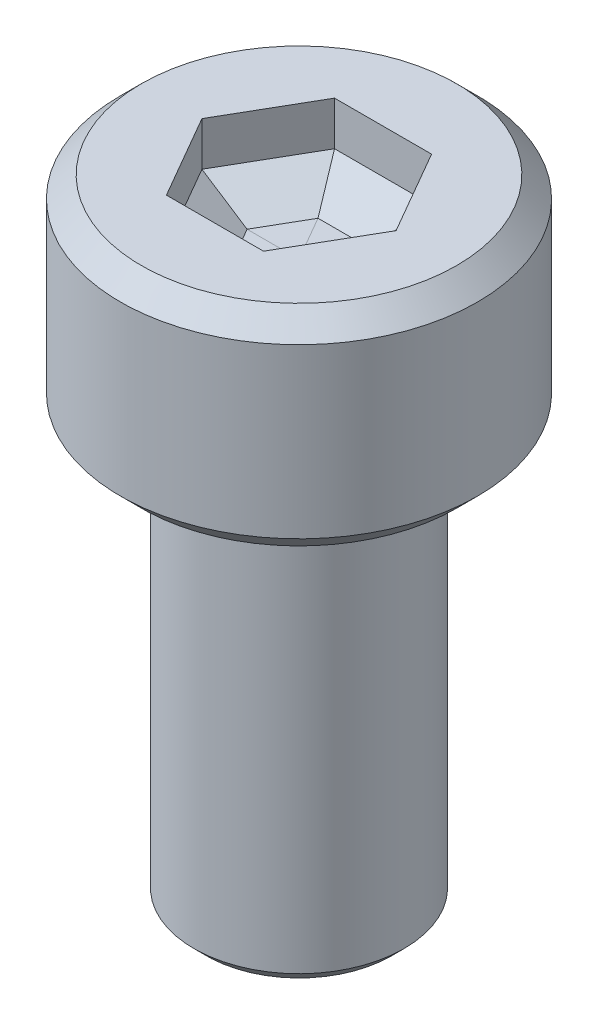
ISO-10303-21;
HEADER;
FILE_DESCRIPTION(('STEP AP214'),'2;1');
FILE_NAME('part.step','',(''),(''),'','','');
FILE_SCHEMA(('AUTOMOTIVE_DESIGN { 1 0 10303 214 1 1 1 1 }'));
ENDSEC;
DATA;
#1=APPLICATION_CONTEXT('core data for automotive mechanical design processes');
#2=APPLICATION_PROTOCOL_DEFINITION('international standard','automotive_design',2000,#1);
#3=PRODUCT_CONTEXT('',#1,'mechanical');
#4=PRODUCT('Part','Part','',(#3));
#5=PRODUCT_RELATED_PRODUCT_CATEGORY('part','',(#4));
#6=PRODUCT_DEFINITION_FORMATION('','',#4);
#7=PRODUCT_DEFINITION_CONTEXT('part definition',#1,'design');
#8=PRODUCT_DEFINITION('design','',#6,#7);
#9=PRODUCT_DEFINITION_SHAPE('','',#8);
#10=(LENGTH_UNIT() NAMED_UNIT(*) SI_UNIT(.MILLI.,.METRE.));
#11=(NAMED_UNIT(*) PLANE_ANGLE_UNIT() SI_UNIT($,.RADIAN.));
#12=(NAMED_UNIT(*) SI_UNIT($,.STERADIAN.) SOLID_ANGLE_UNIT());
#13=UNCERTAINTY_MEASURE_WITH_UNIT(LENGTH_MEASURE(1.E-05),#10,'distance_accuracy_value','');
#14=(GEOMETRIC_REPRESENTATION_CONTEXT(3) GLOBAL_UNCERTAINTY_ASSIGNED_CONTEXT((#13)) GLOBAL_UNIT_ASSIGNED_CONTEXT((#10,
#11,#12)) REPRESENTATION_CONTEXT('',''));
#15=CARTESIAN_POINT('',(0.,0.,0.));
#16=DIRECTION('',(0.,0.,1.));
#17=DIRECTION('',(1.,0.,0.));
#18=AXIS2_PLACEMENT_3D('',#15,#16,#17);
#19=CARTESIAN_POINT('',(4.25,5.00000000000001,0.));
#20=DIRECTION('',(0.,1.,0.));
#21=DIRECTION('',(-1.,0.,0.));
#22=AXIS2_PLACEMENT_3D('',#19,#20,#21);
#23=PLANE('',#22);
#24=DIRECTION('',(0.5,0.,-0.866025403784439));
#25=VECTOR('',#24,1.);
#26=CARTESIAN_POINT('',(-2.30940107675852,4.99999999999998,0.));
#27=LINE('',#26,#25);
#28=CARTESIAN_POINT('',(-2.30940107675852,4.99999999999998,0.));
#29=VERTEX_POINT('',#28);
#30=CARTESIAN_POINT('',(-1.15470053837928,4.99999999999999,-2.));
#31=VERTEX_POINT('',#30);
#32=EDGE_CURVE('E113',#29,#31,#27,.T.);
#33=ORIENTED_EDGE('',*,*,#32,.T.);
#34=DIRECTION('',(1.,0.,0.));
#35=VECTOR('',#34,1.);
#36=CARTESIAN_POINT('',(-1.15470053837929,4.99999999999998,-2.));
#37=LINE('',#36,#35);
#38=CARTESIAN_POINT('',(1.15470053837922,4.99999999999999,-2.00000000000001));
#39=VERTEX_POINT('',#38);
#40=EDGE_CURVE('E137',#31,#39,#37,.T.);
#41=ORIENTED_EDGE('',*,*,#40,.T.);
#42=DIRECTION('',(0.5,0.,0.866025403784439));
#43=VECTOR('',#42,1.);
#44=CARTESIAN_POINT('',(1.15470053837923,4.99999999999999,-2.00000000000001));
#45=LINE('',#44,#43);
#46=CARTESIAN_POINT('',(2.30940107675848,5.,0.));
#47=VERTEX_POINT('',#46);
#48=EDGE_CURVE('E462',#39,#47,#45,.T.);
#49=ORIENTED_EDGE('',*,*,#48,.T.);
#50=DIRECTION('',(-0.5,0.,0.866025403784439));
#51=VECTOR('',#50,1.);
#52=CARTESIAN_POINT('',(2.30940107675848,5.,0.));
#53=LINE('',#52,#51);
#54=CARTESIAN_POINT('',(1.15470053837923,5.,2.));
#55=VERTEX_POINT('',#54);
#56=EDGE_CURVE('E450',#47,#55,#53,.T.);
#57=ORIENTED_EDGE('',*,*,#56,.T.);
#58=DIRECTION('',(-1.,0.,0.));
#59=VECTOR('',#58,1.);
#60=CARTESIAN_POINT('',(1.15470053837923,5.,2.));
#61=LINE('',#60,#59);
#62=CARTESIAN_POINT('',(-1.15470053837927,4.99999999999999,2.));
#63=VERTEX_POINT('',#62);
#64=EDGE_CURVE('E47',#55,#63,#61,.T.);
#65=ORIENTED_EDGE('',*,*,#64,.T.);
#66=DIRECTION('',(-0.5,0.,-0.866025403784439));
#67=VECTOR('',#66,1.);
#68=CARTESIAN_POINT('',(-1.15470053837927,4.99999999999999,2.));
#69=LINE('',#68,#67);
#70=EDGE_CURVE('E106',#63,#29,#69,.T.);
#71=ORIENTED_EDGE('',*,*,#70,.T.);
#72=EDGE_LOOP('',(#33,#41,#49,#57,#65,#71));
#73=FACE_BOUND('',#72,.T.);
#74=CARTESIAN_POINT('',(0.,4.99999999999999,0.));
#75=DIRECTION('',(0.,1.,0.));
#76=DIRECTION('',(-1.,0.,0.));
#77=AXIS2_PLACEMENT_3D('',#74,#75,#76);
#78=CIRCLE('',#77,3.74999999999997);
#79=CARTESIAN_POINT('',(-3.74999999999999,4.99999999999998,0.));
#80=VERTEX_POINT('',#79);
#81=EDGE_CURVE('E11',#80,#80,#78,.T.);
#82=ORIENTED_EDGE('',*,*,#81,.T.);
#83=EDGE_LOOP('',(#82));
#84=FACE_BOUND('',#83,.T.);
#85=ADVANCED_FACE('F32',(#73,#84),#23,.T.);
#86=CARTESIAN_POINT('',(0.,-10.,0.));
#87=DIRECTION('',(0.,-1.,0.));
#88=DIRECTION('',(1.,0.,0.));
#89=AXIS2_PLACEMENT_3D('',#86,#87,#88);
#90=PLANE('',#89);
#91=CARTESIAN_POINT('',(0.,-10.,0.));
#92=DIRECTION('',(0.,-1.,0.));
#93=DIRECTION('',(1.,0.,0.));
#94=AXIS2_PLACEMENT_3D('',#91,#92,#93);
#95=CIRCLE('',#94,2.20000000000008);
#96=CARTESIAN_POINT('',(2.20000000000011,-9.99999999999999,0.));
#97=VERTEX_POINT('',#96);
#98=EDGE_CURVE('E149',#97,#97,#95,.T.);
#99=ORIENTED_EDGE('',*,*,#98,.T.);
#100=EDGE_LOOP('',(#99));
#101=FACE_BOUND('',#100,.T.);
#102=ADVANCED_FACE('F186',(#101),#90,.T.);
#103=CARTESIAN_POINT('',(3.49148133884313E-12,-1001.19875270073,0.));
#104=DIRECTION('',(0.,-1.,0.));
#105=DIRECTION('',(1.,0.,0.));
#106=AXIS2_PLACEMENT_3D('',#103,#104,#105);
#107=CYLINDRICAL_SURFACE('',#106,2.49999999999999);
#108=CARTESIAN_POINT('',(0.,-9.70000000000004,0.));
#109=DIRECTION('',(0.,-1.,0.));
#110=DIRECTION('',(1.,0.,0.));
#111=AXIS2_PLACEMENT_3D('',#108,#109,#110);
#112=CIRCLE('',#111,2.49999999999999);
#113=CARTESIAN_POINT('',(2.50000000000002,-9.70000000000003,0.));
#114=VERTEX_POINT('',#113);
#115=EDGE_CURVE('E152',#114,#114,#112,.F.);
#116=ORIENTED_EDGE('',*,*,#115,.T.);
#117=EDGE_LOOP('',(#116));
#118=FACE_BOUND('',#117,.T.);
#119=CARTESIAN_POINT('',(0.,-0.199999999999978,0.));
#120=DIRECTION('',(0.,-1.,0.));
#121=DIRECTION('',(1.,0.,0.));
#122=AXIS2_PLACEMENT_3D('',#119,#120,#121);
#123=CIRCLE('',#122,2.49999999999999);
#124=CARTESIAN_POINT('',(2.49999999999998,-0.199999999999969,0.));
#125=VERTEX_POINT('',#124);
#126=EDGE_CURVE('E142',#125,#125,#123,.T.);
#127=ORIENTED_EDGE('',*,*,#126,.T.);
#128=EDGE_LOOP('',(#127));
#129=FACE_BOUND('',#128,.T.);
#130=ADVANCED_FACE('F175',(#118,#129),#107,.T.);
#131=CARTESIAN_POINT('',(2.5,0.,0.));
#132=DIRECTION('',(0.,-1.,0.));
#133=DIRECTION('',(1.,0.,0.));
#134=AXIS2_PLACEMENT_3D('',#131,#132,#133);
#135=PLANE('',#134);
#136=CARTESIAN_POINT('',(0.,0.,0.));
#137=DIRECTION('',(0.,-1.,0.));
#138=DIRECTION('',(1.,0.,0.));
#139=AXIS2_PLACEMENT_3D('',#136,#137,#138);
#140=CIRCLE('',#139,3.75000000000006);
#141=CARTESIAN_POINT('',(3.75000000000005,0.,0.));
#142=VERTEX_POINT('',#141);
#143=EDGE_CURVE('E155',#142,#142,#140,.T.);
#144=ORIENTED_EDGE('',*,*,#143,.T.);
#145=EDGE_LOOP('',(#144));
#146=FACE_BOUND('',#145,.T.);
#147=CARTESIAN_POINT('',(0.,0.,0.));
#148=DIRECTION('',(0.,-1.,0.));
#149=DIRECTION('',(1.,0.,0.));
#150=AXIS2_PLACEMENT_3D('',#147,#148,#149);
#151=CIRCLE('',#150,2.69999999999999);
#152=CARTESIAN_POINT('',(2.69999999999998,0.,0.));
#153=VERTEX_POINT('',#152);
#154=EDGE_CURVE('E145',#153,#153,#151,.F.);
#155=ORIENTED_EDGE('',*,*,#154,.T.);
#156=EDGE_LOOP('',(#155));
#157=FACE_BOUND('',#156,.T.);
#158=ADVANCED_FACE('F172',(#146,#157),#135,.T.);
#159=CARTESIAN_POINT('',(3.49148133884313E-12,-1001.19875270073,0.));
#160=DIRECTION('',(0.,-1.,0.));
#161=DIRECTION('',(1.,0.,0.));
#162=AXIS2_PLACEMENT_3D('',#159,#160,#161);
#163=CYLINDRICAL_SURFACE('',#162,4.25000000000001);
#164=CARTESIAN_POINT('',(0.,0.499999999999945,0.));
#165=DIRECTION('',(0.,-1.,0.));
#166=DIRECTION('',(1.,0.,0.));
#167=AXIS2_PLACEMENT_3D('',#164,#165,#166);
#168=CIRCLE('',#167,4.25000000000001);
#169=CARTESIAN_POINT('',(4.25000000000001,0.49999999999996,0.));
#170=VERTEX_POINT('',#169);
#171=EDGE_CURVE('E40',#170,#170,#168,.F.);
#172=ORIENTED_EDGE('',*,*,#171,.T.);
#173=EDGE_LOOP('',(#172));
#174=FACE_BOUND('',#173,.T.);
#175=CARTESIAN_POINT('',(0.,4.49999999999995,0.));
#176=DIRECTION('',(0.,1.,0.));
#177=DIRECTION('',(-1.,0.,0.));
#178=AXIS2_PLACEMENT_3D('',#175,#176,#177);
#179=CIRCLE('',#178,4.25000000000001);
#180=CARTESIAN_POINT('',(-4.25000000000003,4.49999999999993,0.));
#181=VERTEX_POINT('',#180);
#182=EDGE_CURVE('E158',#181,#181,#179,.F.);
#183=ORIENTED_EDGE('',*,*,#182,.T.);
#184=EDGE_LOOP('',(#183));
#185=FACE_BOUND('',#184,.T.);
#186=ADVANCED_FACE('F163',(#174,#185),#163,.T.);
#187=CARTESIAN_POINT('',(0.,-0.199999999999978,0.));
#188=DIRECTION('',(0.,-1.,0.));
#189=DIRECTION('',(1.,0.,0.));
#190=AXIS2_PLACEMENT_3D('',#187,#188,#189);
#191=TOROIDAL_SURFACE('',#190,2.69999999999999,0.2);
#192=ORIENTED_EDGE('',*,*,#154,.F.);
#193=EDGE_LOOP('',(#192));
#194=FACE_BOUND('',#193,.T.);
#195=ORIENTED_EDGE('',*,*,#126,.F.);
#196=EDGE_LOOP('',(#195));
#197=FACE_BOUND('',#196,.T.);
#198=ADVANCED_FACE('F179',(#194,#197),#191,.F.);
#199=CARTESIAN_POINT('',(0.,-10.,0.));
#200=DIRECTION('',(0.,1.,0.));
#201=DIRECTION('',(-1.,0.,0.));
#202=AXIS2_PLACEMENT_3D('',#199,#200,#201);
#203=CONICAL_SURFACE('',#202,2.20000000000007,0.785398163397357);
#204=ORIENTED_EDGE('',*,*,#115,.F.);
#205=EDGE_LOOP('',(#204));
#206=FACE_BOUND('',#205,.T.);
#207=ORIENTED_EDGE('',*,*,#98,.F.);
#208=EDGE_LOOP('',(#207));
#209=FACE_BOUND('',#208,.T.);
#210=ADVANCED_FACE('F169',(#206,#209),#203,.T.);
#211=CARTESIAN_POINT('',(0.,0.,0.));
#212=DIRECTION('',(0.,1.,0.));
#213=DIRECTION('',(-1.,0.,0.));
#214=AXIS2_PLACEMENT_3D('',#211,#212,#213);
#215=CONICAL_SURFACE('',#214,3.75000000000007,0.785398163397449);
#216=ORIENTED_EDGE('',*,*,#171,.F.);
#217=EDGE_LOOP('',(#216));
#218=FACE_BOUND('',#217,.T.);
#219=ORIENTED_EDGE('',*,*,#143,.F.);
#220=EDGE_LOOP('',(#219));
#221=FACE_BOUND('',#220,.T.);
#222=ADVANCED_FACE('F166',(#218,#221),#215,.T.);
#223=CARTESIAN_POINT('',(0.,4.49999999999995,0.));
#224=DIRECTION('',(0.,-1.,0.));
#225=DIRECTION('',(1.,0.,0.));
#226=AXIS2_PLACEMENT_3D('',#223,#224,#225);
#227=CONICAL_SURFACE('',#226,4.25000000000001,0.785398163397449);
#228=ORIENTED_EDGE('',*,*,#81,.F.);
#229=EDGE_LOOP('',(#228));
#230=FACE_BOUND('',#229,.T.);
#231=ORIENTED_EDGE('',*,*,#182,.F.);
#232=EDGE_LOOP('',(#231));
#233=FACE_BOUND('',#232,.T.);
#234=ADVANCED_FACE('F34',(#230,#233),#227,.T.);
#235=CARTESIAN_POINT('',(-2.30940107675852,4.99999999999998,0.));
#236=DIRECTION('',(-0.866025403784439,0.,-0.5));
#237=DIRECTION('',(-0.5,0.,0.866025403784439));
#238=AXIS2_PLACEMENT_3D('',#235,#236,#237);
#239=PLANE('',#238);
#240=ORIENTED_EDGE('',*,*,#32,.F.);
#241=DIRECTION('',(0.,1.,0.));
#242=VECTOR('',#241,1.);
#243=CARTESIAN_POINT('',(-2.30940107675852,4.99999999999998,0.));
#244=LINE('',#243,#242);
#245=CARTESIAN_POINT('',(-2.30940107675851,3.9563163170868,0.));
#246=VERTEX_POINT('',#245);
#247=EDGE_CURVE('E101',#246,#29,#244,.T.);
#248=ORIENTED_EDGE('',*,*,#247,.F.);
#249=DIRECTION('',(0.5,0.,-0.866025403784439));
#250=VECTOR('',#249,1.);
#251=CARTESIAN_POINT('',(-2.30940107675851,3.9563163170868,0.));
#252=LINE('',#251,#250);
#253=CARTESIAN_POINT('',(-1.15470053837927,3.9563163170868,-2.));
#254=VERTEX_POINT('',#253);
#255=EDGE_CURVE('E119',#246,#254,#252,.T.);
#256=ORIENTED_EDGE('',*,*,#255,.T.);
#257=DIRECTION('',(0.,1.,0.));
#258=VECTOR('',#257,1.);
#259=CARTESIAN_POINT('',(-1.15470053837929,4.99999999999998,-2.));
#260=LINE('',#259,#258);
#261=EDGE_CURVE('E115',#254,#31,#260,.T.);
#262=ORIENTED_EDGE('',*,*,#261,.T.);
#263=EDGE_LOOP('',(#240,#248,#256,#262));
#264=FACE_BOUND('',#263,.T.);
#265=ADVANCED_FACE('F114',(#264),#239,.F.);
#266=CARTESIAN_POINT('',(0.,3.25752210362396,0.));
#267=DIRECTION('',(0.,-1.,0.));
#268=DIRECTION('',(1.,0.,0.));
#269=AXIS2_PLACEMENT_3D('',#266,#267,#268);
#270=PLANE('',#269);
#271=DIRECTION('',(0.5,0.,-0.866025403784439));
#272=VECTOR('',#271,1.);
#273=CARTESIAN_POINT('',(-1.23537689685806,3.25752210362395,0.));
#274=LINE('',#273,#272);
#275=CARTESIAN_POINT('',(-1.23537689685807,3.25752210362395,0.));
#276=VERTEX_POINT('',#275);
#277=CARTESIAN_POINT('',(-0.617688448429044,3.25752210362395,-1.06986777592746));
#278=VERTEX_POINT('',#277);
#279=EDGE_CURVE('E134',#276,#278,#274,.T.);
#280=ORIENTED_EDGE('',*,*,#279,.F.);
#281=DIRECTION('',(1.,0.,0.));
#282=VECTOR('',#281,1.);
#283=CARTESIAN_POINT('',(0.,3.25752210362396,0.));
#284=LINE('',#283,#282);
#285=CARTESIAN_POINT('',(0.,3.25752210362396,0.));
#286=VERTEX_POINT('',#285);
#287=EDGE_CURVE('E123',#276,#286,#284,.T.);
#288=ORIENTED_EDGE('',*,*,#287,.T.);
#289=DIRECTION('',(-0.5,0.,-0.866025403784439));
#290=VECTOR('',#289,1.);
#291=CARTESIAN_POINT('',(0.,3.25752210362396,0.));
#292=LINE('',#291,#290);
#293=EDGE_CURVE('E56',#286,#278,#292,.T.);
#294=ORIENTED_EDGE('',*,*,#293,.T.);
#295=EDGE_LOOP('',(#280,#288,#294));
#296=FACE_BOUND('',#295,.T.);
#297=ADVANCED_FACE('F228',(#296),#270,.F.);
#298=CARTESIAN_POINT('',(-2.30940107675851,3.9563163170868,0.));
#299=DIRECTION('',(-0.520184407756901,-0.799506666160745,-0.300328607846694));
#300=DIRECTION('',(0.838201573918949,-0.545360542650269,0.));
#301=AXIS2_PLACEMENT_3D('',#298,#299,#300);
#302=PLANE('',#301);
#303=ORIENTED_EDGE('',*,*,#255,.F.);
#304=DIRECTION('',(0.838201573918949,-0.545360542650269,0.));
#305=VECTOR('',#304,1.);
#306=CARTESIAN_POINT('',(-1.49812940337573,3.42847722229215,0.));
#307=LINE('',#306,#305);
#308=EDGE_CURVE('E125',#246,#276,#307,.T.);
#309=ORIENTED_EDGE('',*,*,#308,.T.);
#310=ORIENTED_EDGE('',*,*,#279,.T.);
#311=DIRECTION('',(-0.419100786959478,0.545360542650269,-0.725903856505909));
#312=VECTOR('',#311,1.);
#313=CARTESIAN_POINT('',(-1.15470053837928,3.9563163170868,-2.));
#314=LINE('',#313,#312);
#315=EDGE_CURVE('E494',#278,#254,#314,.T.);
#316=ORIENTED_EDGE('',*,*,#315,.T.);
#317=EDGE_LOOP('',(#303,#309,#310,#316));
#318=FACE_BOUND('',#317,.T.);
#319=ADVANCED_FACE('F235',(#318),#302,.F.);
#320=CARTESIAN_POINT('',(-1.15470053837927,4.99999999999999,2.));
#321=DIRECTION('',(-0.866025403784439,0.,0.5));
#322=DIRECTION('',(0.5,0.,0.866025403784439));
#323=AXIS2_PLACEMENT_3D('',#320,#321,#322);
#324=PLANE('',#323);
#325=ORIENTED_EDGE('',*,*,#70,.F.);
#326=DIRECTION('',(0.,1.,0.));
#327=VECTOR('',#326,1.);
#328=CARTESIAN_POINT('',(-1.15470053837927,4.99999999999999,2.));
#329=LINE('',#328,#327);
#330=CARTESIAN_POINT('',(-1.15470053837927,3.9563163170868,2.));
#331=VERTEX_POINT('',#330);
#332=EDGE_CURVE('E478',#331,#63,#329,.T.);
#333=ORIENTED_EDGE('',*,*,#332,.F.);
#334=DIRECTION('',(-0.5,0.,-0.866025403784439));
#335=VECTOR('',#334,1.);
#336=CARTESIAN_POINT('',(-1.15470053837926,3.9563163170868,2.));
#337=LINE('',#336,#335);
#338=EDGE_CURVE('E108',#331,#246,#337,.T.);
#339=ORIENTED_EDGE('',*,*,#338,.T.);
#340=ORIENTED_EDGE('',*,*,#247,.T.);
#341=EDGE_LOOP('',(#325,#333,#339,#340));
#342=FACE_BOUND('',#341,.T.);
#343=ADVANCED_FACE('F103',(#342),#324,.F.);
#344=CARTESIAN_POINT('',(0.,3.25752210362396,0.));
#345=DIRECTION('',(0.,-1.,0.));
#346=DIRECTION('',(1.,0.,0.));
#347=AXIS2_PLACEMENT_3D('',#344,#345,#346);
#348=PLANE('',#347);
#349=DIRECTION('',(-0.5,0.,-0.866025403784439));
#350=VECTOR('',#349,1.);
#351=CARTESIAN_POINT('',(-0.617688448429039,3.25752210362395,1.06986777592746));
#352=LINE('',#351,#350);
#353=CARTESIAN_POINT('',(-0.617688448429039,3.25752210362395,1.06986777592746));
#354=VERTEX_POINT('',#353);
#355=EDGE_CURVE('E132',#354,#276,#352,.T.);
#356=ORIENTED_EDGE('',*,*,#355,.F.);
#357=DIRECTION('',(0.5,0.,-0.866025403784439));
#358=VECTOR('',#357,1.);
#359=CARTESIAN_POINT('',(0.,3.25752210362396,0.));
#360=LINE('',#359,#358);
#361=EDGE_CURVE('E479',#354,#286,#360,.T.);
#362=ORIENTED_EDGE('',*,*,#361,.T.);
#363=ORIENTED_EDGE('',*,*,#287,.F.);
#364=EDGE_LOOP('',(#356,#362,#363));
#365=FACE_BOUND('',#364,.T.);
#366=ADVANCED_FACE('F250',(#365),#348,.F.);
#367=CARTESIAN_POINT('',(-1.15470053837926,3.9563163170868,2.));
#368=DIRECTION('',(-0.520184407756901,-0.799506666160745,0.300328607846694));
#369=DIRECTION('',(0.838201573918949,-0.545360542650269,0.));
#370=AXIS2_PLACEMENT_3D('',#367,#368,#369);
#371=PLANE('',#370);
#372=ORIENTED_EDGE('',*,*,#338,.F.);
#373=DIRECTION('',(0.419100786959476,-0.545360542650271,-0.725903856505908));
#374=VECTOR('',#373,1.);
#375=CARTESIAN_POINT('',(-0.749064701687873,3.42847722229216,1.2974181214798));
#376=LINE('',#375,#374);
#377=EDGE_CURVE('E484',#331,#354,#376,.T.);
#378=ORIENTED_EDGE('',*,*,#377,.T.);
#379=ORIENTED_EDGE('',*,*,#355,.T.);
#380=ORIENTED_EDGE('',*,*,#308,.F.);
#381=EDGE_LOOP('',(#372,#378,#379,#380));
#382=FACE_BOUND('',#381,.T.);
#383=ADVANCED_FACE('F257',(#382),#371,.F.);
#384=CARTESIAN_POINT('',(-1.15470053837929,4.99999999999998,-2.));
#385=DIRECTION('',(0.,0.,-1.));
#386=DIRECTION('',(0.,1.,0.));
#387=AXIS2_PLACEMENT_3D('',#384,#385,#386);
#388=PLANE('',#387);
#389=ORIENTED_EDGE('',*,*,#40,.F.);
#390=ORIENTED_EDGE('',*,*,#261,.F.);
#391=DIRECTION('',(1.,0.,0.));
#392=VECTOR('',#391,1.);
#393=CARTESIAN_POINT('',(-1.15470053837928,3.9563163170868,-2.));
#394=LINE('',#393,#392);
#395=CARTESIAN_POINT('',(1.15470053837923,3.95631631708681,-2.));
#396=VERTEX_POINT('',#395);
#397=EDGE_CURVE('E492',#254,#396,#394,.T.);
#398=ORIENTED_EDGE('',*,*,#397,.T.);
#399=DIRECTION('',(0.,1.,0.));
#400=VECTOR('',#399,1.);
#401=CARTESIAN_POINT('',(1.15470053837923,4.99999999999999,-2.00000000000001));
#402=LINE('',#401,#400);
#403=EDGE_CURVE('E467',#396,#39,#402,.T.);
#404=ORIENTED_EDGE('',*,*,#403,.T.);
#405=EDGE_LOOP('',(#389,#390,#398,#404));
#406=FACE_BOUND('',#405,.T.);
#407=ADVANCED_FACE('F265',(#406),#388,.F.);
#408=CARTESIAN_POINT('',(0.,3.25752210362396,0.));
#409=DIRECTION('',(0.,-1.,0.));
#410=DIRECTION('',(0.,0.,-1.));
#411=AXIS2_PLACEMENT_3D('',#408,#409,#410);
#412=PLANE('',#411);
#413=DIRECTION('',(1.,0.,0.));
#414=VECTOR('',#413,1.);
#415=CARTESIAN_POINT('',(-0.617688448429051,3.25752210362395,-1.06986777592746));
#416=LINE('',#415,#414);
#417=CARTESIAN_POINT('',(0.617688448429012,3.25752210362395,-1.06986777592747));
#418=VERTEX_POINT('',#417);
#419=EDGE_CURVE('E128',#278,#418,#416,.T.);
#420=ORIENTED_EDGE('',*,*,#419,.F.);
#421=ORIENTED_EDGE('',*,*,#293,.F.);
#422=DIRECTION('',(0.5,0.,-0.866025403784439));
#423=VECTOR('',#422,1.);
#424=CARTESIAN_POINT('',(0.,3.25752210362396,0.));
#425=LINE('',#424,#423);
#426=EDGE_CURVE('E459',#286,#418,#425,.T.);
#427=ORIENTED_EDGE('',*,*,#426,.T.);
#428=EDGE_LOOP('',(#420,#421,#427));
#429=FACE_BOUND('',#428,.T.);
#430=ADVANCED_FACE('F273',(#429),#412,.F.);
#431=CARTESIAN_POINT('',(-1.15470053837928,3.9563163170868,-2.));
#432=DIRECTION('',(0.,-0.799506666160744,-0.600657215693388));
#433=DIRECTION('',(0.,0.600657215693388,-0.799506666160744));
#434=AXIS2_PLACEMENT_3D('',#431,#432,#433);
#435=PLANE('',#434);
#436=ORIENTED_EDGE('',*,*,#397,.F.);
#437=ORIENTED_EDGE('',*,*,#315,.F.);
#438=ORIENTED_EDGE('',*,*,#419,.T.);
#439=DIRECTION('',(0.419100786959471,0.545360542650272,-0.72590385650591));
#440=VECTOR('',#439,1.);
#441=CARTESIAN_POINT('',(1.15470053837923,3.95631631708681,-2.00000000000001));
#442=LINE('',#441,#440);
#443=EDGE_CURVE('E469',#418,#396,#442,.T.);
#444=ORIENTED_EDGE('',*,*,#443,.T.);
#445=EDGE_LOOP('',(#436,#437,#438,#444));
#446=FACE_BOUND('',#445,.T.);
#447=ADVANCED_FACE('F281',(#446),#435,.F.);
#448=CARTESIAN_POINT('',(1.15470053837923,5.,2.));
#449=DIRECTION('',(0.,0.,1.));
#450=DIRECTION('',(0.,-1.,0.));
#451=AXIS2_PLACEMENT_3D('',#448,#449,#450);
#452=PLANE('',#451);
#453=ORIENTED_EDGE('',*,*,#64,.F.);
#454=DIRECTION('',(0.,1.,0.));
#455=VECTOR('',#454,1.);
#456=CARTESIAN_POINT('',(1.15470053837923,5.,2.));
#457=LINE('',#456,#455);
#458=CARTESIAN_POINT('',(1.15470053837923,3.95631631708681,2.));
#459=VERTEX_POINT('',#458);
#460=EDGE_CURVE('E446',#459,#55,#457,.T.);
#461=ORIENTED_EDGE('',*,*,#460,.F.);
#462=DIRECTION('',(-1.,0.,0.));
#463=VECTOR('',#462,1.);
#464=CARTESIAN_POINT('',(1.15470053837923,3.95631631708681,2.));
#465=LINE('',#464,#463);
#466=EDGE_CURVE('E481',#459,#331,#465,.T.);
#467=ORIENTED_EDGE('',*,*,#466,.T.);
#468=ORIENTED_EDGE('',*,*,#332,.T.);
#469=EDGE_LOOP('',(#453,#461,#467,#468));
#470=FACE_BOUND('',#469,.T.);
#471=ADVANCED_FACE('F288',(#470),#452,.F.);
#472=CARTESIAN_POINT('',(0.,3.25752210362396,0.));
#473=DIRECTION('',(0.,-1.,0.));
#474=DIRECTION('',(0.,0.,-1.));
#475=AXIS2_PLACEMENT_3D('',#472,#473,#474);
#476=PLANE('',#475);
#477=DIRECTION('',(-1.,0.,0.));
#478=VECTOR('',#477,1.);
#479=CARTESIAN_POINT('',(0.617688448429013,3.25752210362395,1.06986777592746));
#480=LINE('',#479,#478);
#481=CARTESIAN_POINT('',(0.617688448429014,3.25752210362395,1.06986777592746));
#482=VERTEX_POINT('',#481);
#483=EDGE_CURVE('E466',#482,#354,#480,.T.);
#484=ORIENTED_EDGE('',*,*,#483,.F.);
#485=DIRECTION('',(-0.5,0.,-0.866025403784439));
#486=VECTOR('',#485,1.);
#487=CARTESIAN_POINT('',(0.,3.25752210362396,0.));
#488=LINE('',#487,#486);
#489=EDGE_CURVE('E458',#482,#286,#488,.T.);
#490=ORIENTED_EDGE('',*,*,#489,.T.);
#491=ORIENTED_EDGE('',*,*,#361,.F.);
#492=EDGE_LOOP('',(#484,#490,#491));
#493=FACE_BOUND('',#492,.T.);
#494=ADVANCED_FACE('F296',(#493),#476,.F.);
#495=CARTESIAN_POINT('',(1.15470053837923,3.95631631708681,2.));
#496=DIRECTION('',(0.,-0.799506666160743,0.600657215693389));
#497=DIRECTION('',(0.,-0.600657215693389,-0.799506666160743));
#498=AXIS2_PLACEMENT_3D('',#495,#496,#497);
#499=PLANE('',#498);
#500=ORIENTED_EDGE('',*,*,#466,.F.);
#501=DIRECTION('',(-0.419100786959472,-0.545360542650274,-0.725903856505908));
#502=VECTOR('',#501,1.);
#503=CARTESIAN_POINT('',(0.749064701687847,3.42847722229216,1.2974181214798));
#504=LINE('',#503,#502);
#505=EDGE_CURVE('E441',#459,#482,#504,.T.);
#506=ORIENTED_EDGE('',*,*,#505,.T.);
#507=ORIENTED_EDGE('',*,*,#483,.T.);
#508=ORIENTED_EDGE('',*,*,#377,.F.);
#509=EDGE_LOOP('',(#500,#506,#507,#508));
#510=FACE_BOUND('',#509,.T.);
#511=ADVANCED_FACE('F303',(#510),#499,.F.);
#512=CARTESIAN_POINT('',(1.15470053837923,4.99999999999999,-2.00000000000001));
#513=DIRECTION('',(0.866025403784439,0.,-0.5));
#514=DIRECTION('',(-0.5,0.,-0.866025403784438));
#515=AXIS2_PLACEMENT_3D('',#512,#513,#514);
#516=PLANE('',#515);
#517=ORIENTED_EDGE('',*,*,#48,.F.);
#518=ORIENTED_EDGE('',*,*,#403,.F.);
#519=DIRECTION('',(0.5,0.,0.866025403784439));
#520=VECTOR('',#519,1.);
#521=CARTESIAN_POINT('',(1.15470053837923,3.95631631708681,-2.00000000000001));
#522=LINE('',#521,#520);
#523=CARTESIAN_POINT('',(2.30940107675848,3.95631631708681,0.));
#524=VERTEX_POINT('',#523);
#525=EDGE_CURVE('E465',#396,#524,#522,.T.);
#526=ORIENTED_EDGE('',*,*,#525,.T.);
#527=DIRECTION('',(0.,1.,0.));
#528=VECTOR('',#527,1.);
#529=CARTESIAN_POINT('',(2.30940107675848,5.,0.));
#530=LINE('',#529,#528);
#531=EDGE_CURVE('E448',#524,#47,#530,.T.);
#532=ORIENTED_EDGE('',*,*,#531,.T.);
#533=EDGE_LOOP('',(#517,#518,#526,#532));
#534=FACE_BOUND('',#533,.T.);
#535=ADVANCED_FACE('F311',(#534),#516,.F.);
#536=CARTESIAN_POINT('',(0.,3.25752210362396,0.));
#537=DIRECTION('',(0.,-1.,0.));
#538=DIRECTION('',(0.,0.,-1.));
#539=AXIS2_PLACEMENT_3D('',#536,#537,#538);
#540=PLANE('',#539);
#541=DIRECTION('',(0.5,0.,0.866025403784439));
#542=VECTOR('',#541,1.);
#543=CARTESIAN_POINT('',(0.617688448429011,3.25752210362395,-1.06986777592747));
#544=LINE('',#543,#542);
#545=CARTESIAN_POINT('',(1.23537689685804,3.25752210362395,0.));
#546=VERTEX_POINT('',#545);
#547=EDGE_CURVE('E470',#418,#546,#544,.T.);
#548=ORIENTED_EDGE('',*,*,#547,.F.);
#549=ORIENTED_EDGE('',*,*,#426,.F.);
#550=DIRECTION('',(1.,0.,0.));
#551=VECTOR('',#550,1.);
#552=CARTESIAN_POINT('',(0.,3.25752210362396,0.));
#553=LINE('',#552,#551);
#554=EDGE_CURVE('E146',#286,#546,#553,.T.);
#555=ORIENTED_EDGE('',*,*,#554,.T.);
#556=EDGE_LOOP('',(#548,#549,#555));
#557=FACE_BOUND('',#556,.T.);
#558=ADVANCED_FACE('F319',(#557),#540,.F.);
#559=CARTESIAN_POINT('',(1.15470053837923,3.95631631708681,-2.00000000000001));
#560=DIRECTION('',(0.520184407756906,-0.799506666160742,-0.300328607846694));
#561=DIRECTION('',(0.838201573918946,0.545360542650274,0.));
#562=AXIS2_PLACEMENT_3D('',#559,#560,#561);
#563=PLANE('',#562);
#564=ORIENTED_EDGE('',*,*,#525,.F.);
#565=ORIENTED_EDGE('',*,*,#443,.F.);
#566=ORIENTED_EDGE('',*,*,#547,.T.);
#567=DIRECTION('',(0.838201573918946,0.545360542650275,0.));
#568=VECTOR('',#567,1.);
#569=CARTESIAN_POINT('',(2.30940107675848,3.95631631708682,0.));
#570=LINE('',#569,#568);
#571=EDGE_CURVE('E438',#546,#524,#570,.T.);
#572=ORIENTED_EDGE('',*,*,#571,.T.);
#573=EDGE_LOOP('',(#564,#565,#566,#572));
#574=FACE_BOUND('',#573,.T.);
#575=ADVANCED_FACE('F327',(#574),#563,.F.);
#576=CARTESIAN_POINT('',(2.30940107675848,5.,0.));
#577=DIRECTION('',(0.866025403784439,0.,0.5));
#578=DIRECTION('',(0.5,0.,-0.866025403784439));
#579=AXIS2_PLACEMENT_3D('',#576,#577,#578);
#580=PLANE('',#579);
#581=ORIENTED_EDGE('',*,*,#56,.F.);
#582=ORIENTED_EDGE('',*,*,#531,.F.);
#583=DIRECTION('',(-0.5,0.,0.866025403784439));
#584=VECTOR('',#583,1.);
#585=CARTESIAN_POINT('',(2.30940107675848,3.95631631708682,0.));
#586=LINE('',#585,#584);
#587=EDGE_CURVE('E435',#524,#459,#586,.T.);
#588=ORIENTED_EDGE('',*,*,#587,.T.);
#589=ORIENTED_EDGE('',*,*,#460,.T.);
#590=EDGE_LOOP('',(#581,#582,#588,#589));
#591=FACE_BOUND('',#590,.T.);
#592=ADVANCED_FACE('F335',(#591),#580,.F.);
#593=CARTESIAN_POINT('',(0.,3.25752210362396,0.));
#594=DIRECTION('',(0.,-1.,0.));
#595=DIRECTION('',(0.,0.,-1.));
#596=AXIS2_PLACEMENT_3D('',#593,#594,#595);
#597=PLANE('',#596);
#598=DIRECTION('',(-0.5,0.,0.866025403784439));
#599=VECTOR('',#598,1.);
#600=CARTESIAN_POINT('',(1.23537689685804,3.25752210362396,0.));
#601=LINE('',#600,#599);
#602=EDGE_CURVE('E445',#546,#482,#601,.T.);
#603=ORIENTED_EDGE('',*,*,#602,.F.);
#604=ORIENTED_EDGE('',*,*,#554,.F.);
#605=ORIENTED_EDGE('',*,*,#489,.F.);
#606=EDGE_LOOP('',(#603,#604,#605));
#607=FACE_BOUND('',#606,.T.);
#608=ADVANCED_FACE('F343',(#607),#597,.F.);
#609=CARTESIAN_POINT('',(2.30940107675848,3.95631631708682,0.));
#610=DIRECTION('',(0.520184407756907,-0.799506666160741,0.300328607846695));
#611=DIRECTION('',(0.838201573918946,0.545360542650275,0.));
#612=AXIS2_PLACEMENT_3D('',#609,#610,#611);
#613=PLANE('',#612);
#614=ORIENTED_EDGE('',*,*,#587,.F.);
#615=ORIENTED_EDGE('',*,*,#571,.F.);
#616=ORIENTED_EDGE('',*,*,#602,.T.);
#617=ORIENTED_EDGE('',*,*,#505,.F.);
#618=EDGE_LOOP('',(#614,#615,#616,#617));
#619=FACE_BOUND('',#618,.T.);
#620=ADVANCED_FACE('F222',(#619),#613,.F.);
#621=CLOSED_SHELL('',(#85,#102,#130,#158,#186,#198,#210,#222,#234,#265,#297,#319,#343,#366,#383,
#407,#430,#447,#471,#494,#511,#535,#558,#575,#592,#608,#620));
#622=MANIFOLD_SOLID_BREP('B2',#621);
#623=ADVANCED_BREP_SHAPE_REPRESENTATION('',(#18,#622),#14);
#624=SHAPE_DEFINITION_REPRESENTATION(#9,#623);
ENDSEC;
END-ISO-10303-21;
